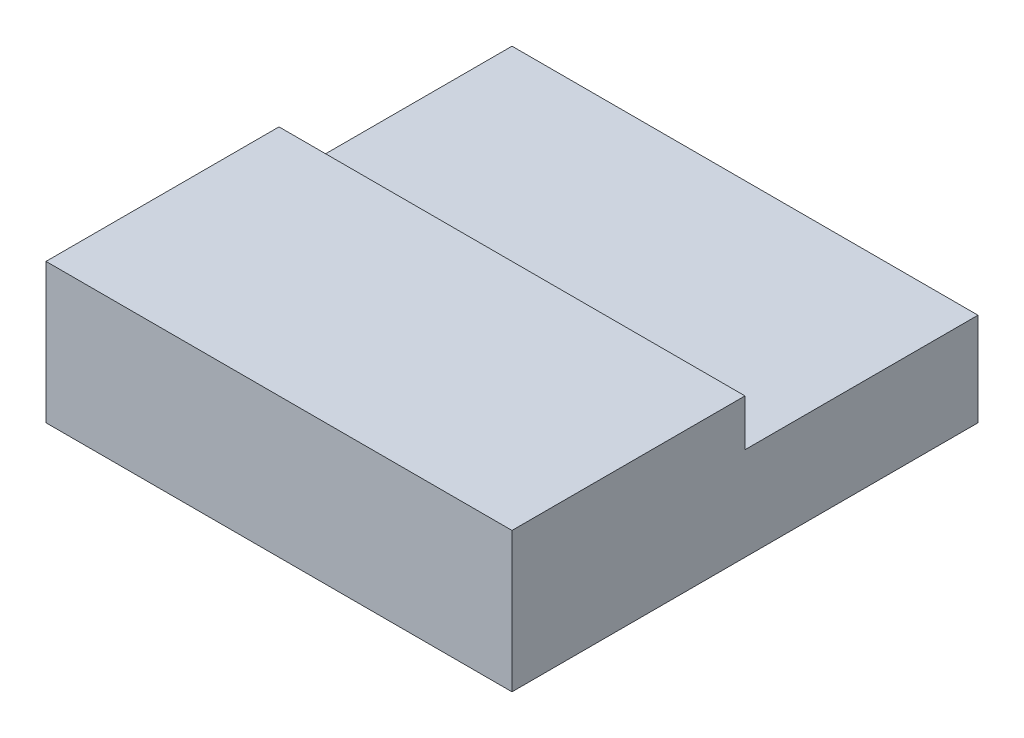
ISO-10303-21;
HEADER;
FILE_DESCRIPTION(('STEP AP214'),'2;1');
FILE_NAME('part.step','',(''),(''),'','','');
FILE_SCHEMA(('AUTOMOTIVE_DESIGN { 1 0 10303 214 1 1 1 1 }'));
ENDSEC;
DATA;
#1=APPLICATION_CONTEXT('core data for automotive mechanical design processes');
#2=APPLICATION_PROTOCOL_DEFINITION('international standard','automotive_design',2000,#1);
#3=PRODUCT_CONTEXT('',#1,'mechanical');
#4=PRODUCT('Part','Part','',(#3));
#5=PRODUCT_RELATED_PRODUCT_CATEGORY('part','',(#4));
#6=PRODUCT_DEFINITION_FORMATION('','',#4);
#7=PRODUCT_DEFINITION_CONTEXT('part definition',#1,'design');
#8=PRODUCT_DEFINITION('design','',#6,#7);
#9=PRODUCT_DEFINITION_SHAPE('','',#8);
#10=(LENGTH_UNIT() NAMED_UNIT(*) SI_UNIT(.MILLI.,.METRE.));
#11=(NAMED_UNIT(*) PLANE_ANGLE_UNIT() SI_UNIT($,.RADIAN.));
#12=(NAMED_UNIT(*) SI_UNIT($,.STERADIAN.) SOLID_ANGLE_UNIT());
#13=UNCERTAINTY_MEASURE_WITH_UNIT(LENGTH_MEASURE(1.E-05),#10,'distance_accuracy_value','');
#14=(GEOMETRIC_REPRESENTATION_CONTEXT(3) GLOBAL_UNCERTAINTY_ASSIGNED_CONTEXT((#13)) GLOBAL_UNIT_ASSIGNED_CONTEXT((#10,
#11,#12)) REPRESENTATION_CONTEXT('',''));
#15=CARTESIAN_POINT('',(0.,0.,0.));
#16=DIRECTION('',(0.,0.,1.));
#17=DIRECTION('',(1.,0.,0.));
#18=AXIS2_PLACEMENT_3D('',#15,#16,#17);
#19=CARTESIAN_POINT('',(-0.5,0.3,-0.5));
#20=DIRECTION('',(0.,0.,1.));
#21=DIRECTION('',(1.,0.,0.));
#22=AXIS2_PLACEMENT_3D('',#19,#20,#21);
#23=PLANE('',#22);
#24=DIRECTION('',(-1.,0.,0.));
#25=VECTOR('',#24,1.);
#26=CARTESIAN_POINT('',(-0.5,0.2,-0.5));
#27=LINE('',#26,#25);
#28=CARTESIAN_POINT('',(0.5,0.2,-0.5));
#29=VERTEX_POINT('',#28);
#30=CARTESIAN_POINT('',(-0.5,0.2,-0.5));
#31=VERTEX_POINT('',#30);
#32=EDGE_CURVE('E121',#29,#31,#27,.T.);
#33=ORIENTED_EDGE('',*,*,#32,.F.);
#34=DIRECTION('',(0.,-1.,0.));
#35=VECTOR('',#34,1.);
#36=CARTESIAN_POINT('',(0.5,0.3,-0.5));
#37=LINE('',#36,#35);
#38=CARTESIAN_POINT('',(0.5,0.,-0.5));
#39=VERTEX_POINT('',#38);
#40=EDGE_CURVE('E88',#29,#39,#37,.T.);
#41=ORIENTED_EDGE('',*,*,#40,.T.);
#42=DIRECTION('',(-1.,0.,0.));
#43=VECTOR('',#42,1.);
#44=CARTESIAN_POINT('',(-0.5,0.,-0.5));
#45=LINE('',#44,#43);
#46=CARTESIAN_POINT('',(-0.5,0.,-0.5));
#47=VERTEX_POINT('',#46);
#48=EDGE_CURVE('E92',#39,#47,#45,.T.);
#49=ORIENTED_EDGE('',*,*,#48,.T.);
#50=DIRECTION('',(0.,-1.,0.));
#51=VECTOR('',#50,1.);
#52=CARTESIAN_POINT('',(-0.5,0.3,-0.5));
#53=LINE('',#52,#51);
#54=EDGE_CURVE('E78',#31,#47,#53,.T.);
#55=ORIENTED_EDGE('',*,*,#54,.F.);
#56=EDGE_LOOP('',(#33,#41,#49,#55));
#57=FACE_BOUND('',#56,.T.);
#58=ADVANCED_FACE('F34',(#57),#23,.F.);
#59=CARTESIAN_POINT('',(-0.5,0.3,-0.5));
#60=DIRECTION('',(1.,0.,0.));
#61=DIRECTION('',(0.,0.,-1.));
#62=AXIS2_PLACEMENT_3D('',#59,#60,#61);
#63=PLANE('',#62);
#64=DIRECTION('',(0.,0.,1.));
#65=VECTOR('',#64,1.);
#66=CARTESIAN_POINT('',(-0.5,0.3,-0.5));
#67=LINE('',#66,#65);
#68=CARTESIAN_POINT('',(-0.5,0.3,0.));
#69=VERTEX_POINT('',#68);
#70=CARTESIAN_POINT('',(-0.5,0.3,0.5));
#71=VERTEX_POINT('',#70);
#72=EDGE_CURVE('E97',#69,#71,#67,.T.);
#73=ORIENTED_EDGE('',*,*,#72,.F.);
#74=DIRECTION('',(0.,1.,0.));
#75=VECTOR('',#74,1.);
#76=CARTESIAN_POINT('',(-0.5,0.2,0.));
#77=LINE('',#76,#75);
#78=CARTESIAN_POINT('',(-0.5,0.2,0.));
#79=VERTEX_POINT('',#78);
#80=EDGE_CURVE('E49',#79,#69,#77,.T.);
#81=ORIENTED_EDGE('',*,*,#80,.F.);
#82=DIRECTION('',(0.,0.,1.));
#83=VECTOR('',#82,1.);
#84=CARTESIAN_POINT('',(-0.5,0.2,-0.5));
#85=LINE('',#84,#83);
#86=EDGE_CURVE('E85',#31,#79,#85,.T.);
#87=ORIENTED_EDGE('',*,*,#86,.F.);
#88=ORIENTED_EDGE('',*,*,#54,.T.);
#89=DIRECTION('',(0.,0.,1.));
#90=VECTOR('',#89,1.);
#91=CARTESIAN_POINT('',(-0.5,0.,-0.5));
#92=LINE('',#91,#90);
#93=CARTESIAN_POINT('',(-0.5,0.,0.5));
#94=VERTEX_POINT('',#93);
#95=EDGE_CURVE('E83',#47,#94,#92,.T.);
#96=ORIENTED_EDGE('',*,*,#95,.T.);
#97=DIRECTION('',(0.,-1.,0.));
#98=VECTOR('',#97,1.);
#99=CARTESIAN_POINT('',(-0.5,0.3,0.5));
#100=LINE('',#99,#98);
#101=EDGE_CURVE('E11',#71,#94,#100,.T.);
#102=ORIENTED_EDGE('',*,*,#101,.F.);
#103=EDGE_LOOP('',(#73,#81,#87,#88,#96,#102));
#104=FACE_BOUND('',#103,.T.);
#105=ADVANCED_FACE('F36',(#104),#63,.F.);
#106=CARTESIAN_POINT('',(-0.5,0.3,0.5));
#107=DIRECTION('',(0.,0.,-1.));
#108=DIRECTION('',(-1.,0.,0.));
#109=AXIS2_PLACEMENT_3D('',#106,#107,#108);
#110=PLANE('',#109);
#111=DIRECTION('',(1.,0.,0.));
#112=VECTOR('',#111,1.);
#113=CARTESIAN_POINT('',(-0.5,0.,0.5));
#114=LINE('',#113,#112);
#115=CARTESIAN_POINT('',(0.5,0.,0.5));
#116=VERTEX_POINT('',#115);
#117=EDGE_CURVE('E101',#94,#116,#114,.T.);
#118=ORIENTED_EDGE('',*,*,#117,.T.);
#119=DIRECTION('',(0.,-1.,0.));
#120=VECTOR('',#119,1.);
#121=CARTESIAN_POINT('',(0.5,0.3,0.5));
#122=LINE('',#121,#120);
#123=CARTESIAN_POINT('',(0.5,0.3,0.5));
#124=VERTEX_POINT('',#123);
#125=EDGE_CURVE('E42',#124,#116,#122,.T.);
#126=ORIENTED_EDGE('',*,*,#125,.F.);
#127=DIRECTION('',(1.,0.,0.));
#128=VECTOR('',#127,1.);
#129=CARTESIAN_POINT('',(-0.5,0.3,0.5));
#130=LINE('',#129,#128);
#131=EDGE_CURVE('E58',#71,#124,#130,.T.);
#132=ORIENTED_EDGE('',*,*,#131,.F.);
#133=ORIENTED_EDGE('',*,*,#101,.T.);
#134=EDGE_LOOP('',(#118,#126,#132,#133));
#135=FACE_BOUND('',#134,.T.);
#136=ADVANCED_FACE('F117',(#135),#110,.F.);
#137=CARTESIAN_POINT('',(0.5,0.3,-0.5));
#138=DIRECTION('',(-1.,0.,0.));
#139=DIRECTION('',(0.,0.,1.));
#140=AXIS2_PLACEMENT_3D('',#137,#138,#139);
#141=PLANE('',#140);
#142=DIRECTION('',(0.,0.,-1.));
#143=VECTOR('',#142,1.);
#144=CARTESIAN_POINT('',(0.5,0.2,-0.5));
#145=LINE('',#144,#143);
#146=CARTESIAN_POINT('',(0.5,0.2,0.));
#147=VERTEX_POINT('',#146);
#148=EDGE_CURVE('E127',#147,#29,#145,.T.);
#149=ORIENTED_EDGE('',*,*,#148,.F.);
#150=DIRECTION('',(0.,1.,0.));
#151=VECTOR('',#150,1.);
#152=CARTESIAN_POINT('',(0.5,0.2,0.));
#153=LINE('',#152,#151);
#154=CARTESIAN_POINT('',(0.5,0.3,0.));
#155=VERTEX_POINT('',#154);
#156=EDGE_CURVE('E102',#147,#155,#153,.T.);
#157=ORIENTED_EDGE('',*,*,#156,.T.);
#158=DIRECTION('',(0.,0.,-1.));
#159=VECTOR('',#158,1.);
#160=CARTESIAN_POINT('',(0.5,0.3,-0.5));
#161=LINE('',#160,#159);
#162=EDGE_CURVE('E89',#124,#155,#161,.T.);
#163=ORIENTED_EDGE('',*,*,#162,.F.);
#164=ORIENTED_EDGE('',*,*,#125,.T.);
#165=DIRECTION('',(0.,0.,-1.));
#166=VECTOR('',#165,1.);
#167=CARTESIAN_POINT('',(0.5,0.,-0.5));
#168=LINE('',#167,#166);
#169=EDGE_CURVE('E98',#116,#39,#168,.T.);
#170=ORIENTED_EDGE('',*,*,#169,.T.);
#171=ORIENTED_EDGE('',*,*,#40,.F.);
#172=EDGE_LOOP('',(#149,#157,#163,#164,#170,#171));
#173=FACE_BOUND('',#172,.T.);
#174=ADVANCED_FACE('F115',(#173),#141,.F.);
#175=CARTESIAN_POINT('',(0.,0.3,0.));
#176=DIRECTION('',(0.,1.,0.));
#177=DIRECTION('',(0.,0.,1.));
#178=AXIS2_PLACEMENT_3D('',#175,#176,#177);
#179=PLANE('',#178);
#180=DIRECTION('',(1.,0.,0.));
#181=VECTOR('',#180,1.);
#182=CARTESIAN_POINT('',(-0.5,0.3,0.));
#183=LINE('',#182,#181);
#184=EDGE_CURVE('E123',#69,#155,#183,.T.);
#185=ORIENTED_EDGE('',*,*,#184,.F.);
#186=ORIENTED_EDGE('',*,*,#72,.T.);
#187=ORIENTED_EDGE('',*,*,#131,.T.);
#188=ORIENTED_EDGE('',*,*,#162,.T.);
#189=EDGE_LOOP('',(#185,#186,#187,#188));
#190=FACE_BOUND('',#189,.T.);
#191=ADVANCED_FACE('F143',(#190),#179,.T.);
#192=CARTESIAN_POINT('',(0.,0.,0.));
#193=DIRECTION('',(0.,1.,0.));
#194=DIRECTION('',(0.,0.,1.));
#195=AXIS2_PLACEMENT_3D('',#192,#193,#194);
#196=PLANE('',#195);
#197=ORIENTED_EDGE('',*,*,#95,.F.);
#198=ORIENTED_EDGE('',*,*,#48,.F.);
#199=ORIENTED_EDGE('',*,*,#169,.F.);
#200=ORIENTED_EDGE('',*,*,#117,.F.);
#201=EDGE_LOOP('',(#197,#198,#199,#200));
#202=FACE_BOUND('',#201,.T.);
#203=ADVANCED_FACE('F100',(#202),#196,.F.);
#204=CARTESIAN_POINT('',(-0.5,0.2,0.));
#205=DIRECTION('',(0.,0.,1.));
#206=DIRECTION('',(1.,0.,0.));
#207=AXIS2_PLACEMENT_3D('',#204,#205,#206);
#208=PLANE('',#207);
#209=ORIENTED_EDGE('',*,*,#184,.T.);
#210=ORIENTED_EDGE('',*,*,#156,.F.);
#211=DIRECTION('',(1.,0.,0.));
#212=VECTOR('',#211,1.);
#213=CARTESIAN_POINT('',(-0.5,0.2,0.));
#214=LINE('',#213,#212);
#215=EDGE_CURVE('E130',#79,#147,#214,.T.);
#216=ORIENTED_EDGE('',*,*,#215,.F.);
#217=ORIENTED_EDGE('',*,*,#80,.T.);
#218=EDGE_LOOP('',(#209,#210,#216,#217));
#219=FACE_BOUND('',#218,.T.);
#220=ADVANCED_FACE('F144',(#219),#208,.F.);
#221=CARTESIAN_POINT('',(0.,0.2,0.));
#222=DIRECTION('',(0.,1.,0.));
#223=DIRECTION('',(0.,0.,1.));
#224=AXIS2_PLACEMENT_3D('',#221,#222,#223);
#225=PLANE('',#224);
#226=ORIENTED_EDGE('',*,*,#86,.T.);
#227=ORIENTED_EDGE('',*,*,#215,.T.);
#228=ORIENTED_EDGE('',*,*,#148,.T.);
#229=ORIENTED_EDGE('',*,*,#32,.T.);
#230=EDGE_LOOP('',(#226,#227,#228,#229));
#231=FACE_BOUND('',#230,.T.);
#232=ADVANCED_FACE('F134',(#231),#225,.T.);
#233=CLOSED_SHELL('',(#58,#105,#136,#174,#191,#203,#220,#232));
#234=MANIFOLD_SOLID_BREP('B2',#233);
#235=ADVANCED_BREP_SHAPE_REPRESENTATION('',(#18,#234),#14);
#236=SHAPE_DEFINITION_REPRESENTATION(#9,#235);
ENDSEC;
END-ISO-10303-21;
